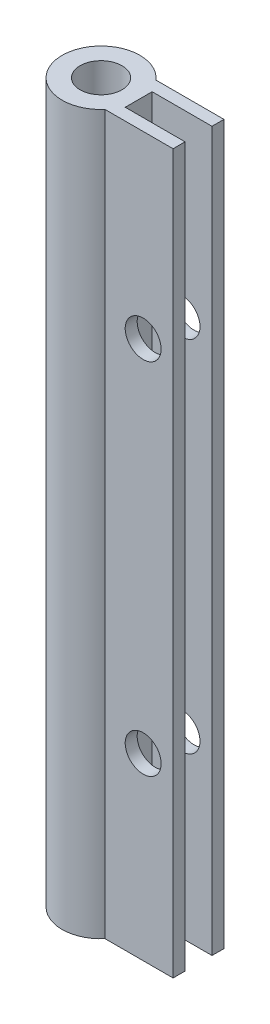
ISO-10303-21;
HEADER;
FILE_DESCRIPTION(('STEP AP214'),'2;1');
FILE_NAME('part.step','',(''),(''),'','','');
FILE_SCHEMA(('AUTOMOTIVE_DESIGN { 1 0 10303 214 1 1 1 1 }'));
ENDSEC;
DATA;
#1=APPLICATION_CONTEXT('core data for automotive mechanical design processes');
#2=APPLICATION_PROTOCOL_DEFINITION('international standard','automotive_design',2000,#1);
#3=PRODUCT_CONTEXT('',#1,'mechanical');
#4=PRODUCT('Part','Part','',(#3));
#5=PRODUCT_RELATED_PRODUCT_CATEGORY('part','',(#4));
#6=PRODUCT_DEFINITION_FORMATION('','',#4);
#7=PRODUCT_DEFINITION_CONTEXT('part definition',#1,'design');
#8=PRODUCT_DEFINITION('design','',#6,#7);
#9=PRODUCT_DEFINITION_SHAPE('','',#8);
#10=(LENGTH_UNIT() NAMED_UNIT(*) SI_UNIT(.MILLI.,.METRE.));
#11=(NAMED_UNIT(*) PLANE_ANGLE_UNIT() SI_UNIT($,.RADIAN.));
#12=(NAMED_UNIT(*) SI_UNIT($,.STERADIAN.) SOLID_ANGLE_UNIT());
#13=UNCERTAINTY_MEASURE_WITH_UNIT(LENGTH_MEASURE(1.E-05),#10,'distance_accuracy_value','');
#14=(GEOMETRIC_REPRESENTATION_CONTEXT(3) GLOBAL_UNCERTAINTY_ASSIGNED_CONTEXT((#13)) GLOBAL_UNIT_ASSIGNED_CONTEXT((#10,
#11,#12)) REPRESENTATION_CONTEXT('',''));
#15=CARTESIAN_POINT('',(0.,0.,0.));
#16=DIRECTION('',(0.,0.,1.));
#17=DIRECTION('',(1.,0.,0.));
#18=AXIS2_PLACEMENT_3D('',#15,#16,#17);
#19=CARTESIAN_POINT('',(0.,60.,0.));
#20=DIRECTION('',(0.,1.,0.));
#21=DIRECTION('',(0.,0.,1.));
#22=AXIS2_PLACEMENT_3D('',#19,#20,#21);
#23=PLANE('',#22);
#24=DIRECTION('',(1.,0.,0.));
#25=VECTOR('',#24,1.);
#26=CARTESIAN_POINT('',(2.45903944661325,60.,2.125));
#27=LINE('',#26,#25);
#28=CARTESIAN_POINT('',(2.45903944661325,60.,2.125));
#29=VERTEX_POINT('',#28);
#30=CARTESIAN_POINT('',(8.14420001013971,60.,2.125));
#31=VERTEX_POINT('',#30);
#32=EDGE_CURVE('E147',#29,#31,#27,.T.);
#33=ORIENTED_EDGE('',*,*,#32,.T.);
#34=DIRECTION('',(0.,0.,-1.));
#35=VECTOR('',#34,1.);
#36=CARTESIAN_POINT('',(8.14420001013971,60.,1.125));
#37=LINE('',#36,#35);
#38=CARTESIAN_POINT('',(8.14420001013971,60.,1.125));
#39=VERTEX_POINT('',#38);
#40=EDGE_CURVE('E95',#31,#39,#37,.T.);
#41=ORIENTED_EDGE('',*,*,#40,.T.);
#42=DIRECTION('',(-1.,0.,0.));
#43=VECTOR('',#42,1.);
#44=CARTESIAN_POINT('',(3.14420001013971,60.,1.125));
#45=LINE('',#44,#43);
#46=CARTESIAN_POINT('',(3.14420001013971,60.,1.125));
#47=VERTEX_POINT('',#46);
#48=EDGE_CURVE('E190',#39,#47,#45,.T.);
#49=ORIENTED_EDGE('',*,*,#48,.T.);
#50=DIRECTION('',(0.,0.,-1.));
#51=VECTOR('',#50,1.);
#52=CARTESIAN_POINT('',(3.14420001013971,60.,-1.125));
#53=LINE('',#52,#51);
#54=CARTESIAN_POINT('',(3.14420001013971,60.,-1.125));
#55=VERTEX_POINT('',#54);
#56=EDGE_CURVE('E192',#47,#55,#53,.T.);
#57=ORIENTED_EDGE('',*,*,#56,.T.);
#58=DIRECTION('',(1.,0.,0.));
#59=VECTOR('',#58,1.);
#60=CARTESIAN_POINT('',(3.14420001013971,60.,-1.125));
#61=LINE('',#60,#59);
#62=CARTESIAN_POINT('',(8.14420001013971,60.,-1.125));
#63=VERTEX_POINT('',#62);
#64=EDGE_CURVE('E114',#55,#63,#61,.T.);
#65=ORIENTED_EDGE('',*,*,#64,.T.);
#66=DIRECTION('',(0.,0.,-1.));
#67=VECTOR('',#66,1.);
#68=CARTESIAN_POINT('',(8.14420001013971,60.,-2.125));
#69=LINE('',#68,#67);
#70=CARTESIAN_POINT('',(8.14420001013971,60.,-2.125));
#71=VERTEX_POINT('',#70);
#72=EDGE_CURVE('E108',#63,#71,#69,.T.);
#73=ORIENTED_EDGE('',*,*,#72,.T.);
#74=DIRECTION('',(-1.,0.,0.));
#75=VECTOR('',#74,1.);
#76=CARTESIAN_POINT('',(2.45903944661325,60.,-2.125));
#77=LINE('',#76,#75);
#78=CARTESIAN_POINT('',(2.45903944661325,60.,-2.125));
#79=VERTEX_POINT('',#78);
#80=EDGE_CURVE('E112',#71,#79,#77,.T.);
#81=ORIENTED_EDGE('',*,*,#80,.T.);
#82=CARTESIAN_POINT('',(0.,60.,0.));
#83=DIRECTION('',(0.,1.,0.));
#84=DIRECTION('',(0.,0.,1.));
#85=AXIS2_PLACEMENT_3D('',#82,#83,#84);
#86=CIRCLE('',#85,3.25);
#87=EDGE_CURVE('E52',#79,#29,#86,.T.);
#88=ORIENTED_EDGE('',*,*,#87,.T.);
#89=EDGE_LOOP('',(#33,#41,#49,#57,#65,#73,#81,#88));
#90=FACE_BOUND('',#89,.T.);
#91=CARTESIAN_POINT('',(0.,60.,0.));
#92=DIRECTION('',(0.,1.,0.));
#93=DIRECTION('',(0.,0.,1.));
#94=AXIS2_PLACEMENT_3D('',#91,#92,#93);
#95=CIRCLE('',#94,1.75);
#96=CARTESIAN_POINT('',(0.,60.,1.75));
#97=VERTEX_POINT('',#96);
#98=EDGE_CURVE('E136',#97,#97,#95,.T.);
#99=ORIENTED_EDGE('',*,*,#98,.F.);
#100=EDGE_LOOP('',(#99));
#101=FACE_BOUND('',#100,.T.);
#102=ADVANCED_FACE('F33',(#90,#101),#23,.T.);
#103=CARTESIAN_POINT('',(0.,0.,0.));
#104=DIRECTION('',(0.,1.,0.));
#105=DIRECTION('',(0.,0.,1.));
#106=AXIS2_PLACEMENT_3D('',#103,#104,#105);
#107=PLANE('',#106);
#108=DIRECTION('',(1.,0.,0.));
#109=VECTOR('',#108,1.);
#110=CARTESIAN_POINT('',(2.45903944661325,0.,2.125));
#111=LINE('',#110,#109);
#112=CARTESIAN_POINT('',(2.45903944661325,0.,2.125));
#113=VERTEX_POINT('',#112);
#114=CARTESIAN_POINT('',(8.14420001013971,0.,2.125));
#115=VERTEX_POINT('',#114);
#116=EDGE_CURVE('E132',#113,#115,#111,.T.);
#117=ORIENTED_EDGE('',*,*,#116,.F.);
#118=CARTESIAN_POINT('',(0.,0.,0.));
#119=DIRECTION('',(0.,1.,0.));
#120=DIRECTION('',(0.,0.,1.));
#121=AXIS2_PLACEMENT_3D('',#118,#119,#120);
#122=CIRCLE('',#121,3.25);
#123=CARTESIAN_POINT('',(2.45903944661325,0.,-2.125));
#124=VERTEX_POINT('',#123);
#125=EDGE_CURVE('E87',#124,#113,#122,.T.);
#126=ORIENTED_EDGE('',*,*,#125,.F.);
#127=DIRECTION('',(-1.,0.,0.));
#128=VECTOR('',#127,1.);
#129=CARTESIAN_POINT('',(2.45903944661325,0.,-2.125));
#130=LINE('',#129,#128);
#131=CARTESIAN_POINT('',(8.14420001013971,0.,-2.125));
#132=VERTEX_POINT('',#131);
#133=EDGE_CURVE('E81',#132,#124,#130,.T.);
#134=ORIENTED_EDGE('',*,*,#133,.F.);
#135=DIRECTION('',(0.,0.,-1.));
#136=VECTOR('',#135,1.);
#137=CARTESIAN_POINT('',(8.14420001013971,0.,-2.125));
#138=LINE('',#137,#136);
#139=CARTESIAN_POINT('',(8.14420001013971,0.,-1.125));
#140=VERTEX_POINT('',#139);
#141=EDGE_CURVE('E122',#140,#132,#138,.T.);
#142=ORIENTED_EDGE('',*,*,#141,.F.);
#143=DIRECTION('',(1.,0.,0.));
#144=VECTOR('',#143,1.);
#145=CARTESIAN_POINT('',(3.14420001013971,0.,-1.125));
#146=LINE('',#145,#144);
#147=CARTESIAN_POINT('',(3.14420001013971,0.,-1.125));
#148=VERTEX_POINT('',#147);
#149=EDGE_CURVE('E142',#148,#140,#146,.T.);
#150=ORIENTED_EDGE('',*,*,#149,.F.);
#151=DIRECTION('',(0.,0.,-1.));
#152=VECTOR('',#151,1.);
#153=CARTESIAN_POINT('',(3.14420001013971,0.,-1.125));
#154=LINE('',#153,#152);
#155=CARTESIAN_POINT('',(3.14420001013971,0.,1.125));
#156=VERTEX_POINT('',#155);
#157=EDGE_CURVE('E140',#156,#148,#154,.T.);
#158=ORIENTED_EDGE('',*,*,#157,.F.);
#159=DIRECTION('',(-1.,0.,0.));
#160=VECTOR('',#159,1.);
#161=CARTESIAN_POINT('',(3.14420001013971,0.,1.125));
#162=LINE('',#161,#160);
#163=CARTESIAN_POINT('',(8.14420001013971,0.,1.125));
#164=VERTEX_POINT('',#163);
#165=EDGE_CURVE('E138',#164,#156,#162,.T.);
#166=ORIENTED_EDGE('',*,*,#165,.F.);
#167=DIRECTION('',(0.,0.,-1.));
#168=VECTOR('',#167,1.);
#169=CARTESIAN_POINT('',(8.14420001013971,0.,1.125));
#170=LINE('',#169,#168);
#171=EDGE_CURVE('E135',#115,#164,#170,.T.);
#172=ORIENTED_EDGE('',*,*,#171,.F.);
#173=EDGE_LOOP('',(#117,#126,#134,#142,#150,#158,#166,#172));
#174=FACE_BOUND('',#173,.T.);
#175=CARTESIAN_POINT('',(0.,0.,0.));
#176=DIRECTION('',(0.,1.,0.));
#177=DIRECTION('',(0.,0.,1.));
#178=AXIS2_PLACEMENT_3D('',#175,#176,#177);
#179=CIRCLE('',#178,1.75);
#180=CARTESIAN_POINT('',(0.,0.,1.75));
#181=VERTEX_POINT('',#180);
#182=EDGE_CURVE('E183',#181,#181,#179,.T.);
#183=ORIENTED_EDGE('',*,*,#182,.T.);
#184=EDGE_LOOP('',(#183));
#185=FACE_BOUND('',#184,.T.);
#186=ADVANCED_FACE('F205',(#174,#185),#107,.F.);
#187=CARTESIAN_POINT('',(2.45903944661325,60.,2.125));
#188=DIRECTION('',(0.,0.,-1.));
#189=DIRECTION('',(-1.,0.,0.));
#190=AXIS2_PLACEMENT_3D('',#187,#188,#189);
#191=PLANE('',#190);
#192=CARTESIAN_POINT('',(5.64420001013971,45.,2.125));
#193=DIRECTION('',(0.,0.,1.));
#194=DIRECTION('',(1.,0.,0.));
#195=AXIS2_PLACEMENT_3D('',#192,#193,#194);
#196=CIRCLE('',#195,1.5);
#197=CARTESIAN_POINT('',(7.14420001013971,45.,2.125));
#198=VERTEX_POINT('',#197);
#199=EDGE_CURVE('E161',#198,#198,#196,.T.);
#200=ORIENTED_EDGE('',*,*,#199,.F.);
#201=EDGE_LOOP('',(#200));
#202=FACE_BOUND('',#201,.T.);
#203=CARTESIAN_POINT('',(5.64420001013972,15.,2.125));
#204=DIRECTION('',(0.,0.,1.));
#205=DIRECTION('',(1.,0.,0.));
#206=AXIS2_PLACEMENT_3D('',#203,#204,#205);
#207=CIRCLE('',#206,1.5);
#208=CARTESIAN_POINT('',(7.14420001013972,15.,2.125));
#209=VERTEX_POINT('',#208);
#210=EDGE_CURVE('E168',#209,#209,#207,.T.);
#211=ORIENTED_EDGE('',*,*,#210,.F.);
#212=EDGE_LOOP('',(#211));
#213=FACE_BOUND('',#212,.T.);
#214=ORIENTED_EDGE('',*,*,#116,.T.);
#215=DIRECTION('',(0.,-1.,0.));
#216=VECTOR('',#215,1.);
#217=CARTESIAN_POINT('',(8.14420001013971,60.,2.125));
#218=LINE('',#217,#216);
#219=EDGE_CURVE('E11',#31,#115,#218,.T.);
#220=ORIENTED_EDGE('',*,*,#219,.F.);
#221=ORIENTED_EDGE('',*,*,#32,.F.);
#222=DIRECTION('',(0.,-1.,0.));
#223=VECTOR('',#222,1.);
#224=CARTESIAN_POINT('',(2.45903944661325,60.,2.125));
#225=LINE('',#224,#223);
#226=EDGE_CURVE('E128',#29,#113,#225,.T.);
#227=ORIENTED_EDGE('',*,*,#226,.T.);
#228=EDGE_LOOP('',(#214,#220,#221,#227));
#229=FACE_BOUND('',#228,.T.);
#230=ADVANCED_FACE('F35',(#202,#213,#229),#191,.F.);
#231=CARTESIAN_POINT('',(8.14420001013971,60.,1.125));
#232=DIRECTION('',(-1.,0.,0.));
#233=DIRECTION('',(0.,0.,1.));
#234=AXIS2_PLACEMENT_3D('',#231,#232,#233);
#235=PLANE('',#234);
#236=ORIENTED_EDGE('',*,*,#171,.T.);
#237=DIRECTION('',(0.,-1.,0.));
#238=VECTOR('',#237,1.);
#239=CARTESIAN_POINT('',(8.14420001013971,60.,1.125));
#240=LINE('',#239,#238);
#241=EDGE_CURVE('E43',#39,#164,#240,.T.);
#242=ORIENTED_EDGE('',*,*,#241,.F.);
#243=ORIENTED_EDGE('',*,*,#40,.F.);
#244=ORIENTED_EDGE('',*,*,#219,.T.);
#245=EDGE_LOOP('',(#236,#242,#243,#244));
#246=FACE_BOUND('',#245,.T.);
#247=ADVANCED_FACE('F266',(#246),#235,.F.);
#248=CARTESIAN_POINT('',(3.14420001013971,60.,1.125));
#249=DIRECTION('',(0.,0.,1.));
#250=DIRECTION('',(1.,0.,0.));
#251=AXIS2_PLACEMENT_3D('',#248,#249,#250);
#252=PLANE('',#251);
#253=CARTESIAN_POINT('',(5.64420001013971,45.,1.125));
#254=DIRECTION('',(0.,0.,1.));
#255=DIRECTION('',(1.,0.,0.));
#256=AXIS2_PLACEMENT_3D('',#253,#254,#255);
#257=CIRCLE('',#256,1.5);
#258=CARTESIAN_POINT('',(7.14420001013971,45.,1.125));
#259=VERTEX_POINT('',#258);
#260=EDGE_CURVE('E180',#259,#259,#257,.T.);
#261=ORIENTED_EDGE('',*,*,#260,.T.);
#262=EDGE_LOOP('',(#261));
#263=FACE_BOUND('',#262,.T.);
#264=CARTESIAN_POINT('',(5.64420001013972,15.,1.125));
#265=DIRECTION('',(0.,0.,1.));
#266=DIRECTION('',(1.,0.,0.));
#267=AXIS2_PLACEMENT_3D('',#264,#265,#266);
#268=CIRCLE('',#267,1.5);
#269=CARTESIAN_POINT('',(7.14420001013972,15.,1.125));
#270=VERTEX_POINT('',#269);
#271=EDGE_CURVE('E165',#270,#270,#268,.T.);
#272=ORIENTED_EDGE('',*,*,#271,.T.);
#273=EDGE_LOOP('',(#272));
#274=FACE_BOUND('',#273,.T.);
#275=ORIENTED_EDGE('',*,*,#165,.T.);
#276=DIRECTION('',(0.,-1.,0.));
#277=VECTOR('',#276,1.);
#278=CARTESIAN_POINT('',(3.14420001013971,60.,1.125));
#279=LINE('',#278,#277);
#280=EDGE_CURVE('E154',#47,#156,#279,.T.);
#281=ORIENTED_EDGE('',*,*,#280,.F.);
#282=ORIENTED_EDGE('',*,*,#48,.F.);
#283=ORIENTED_EDGE('',*,*,#241,.T.);
#284=EDGE_LOOP('',(#275,#281,#282,#283));
#285=FACE_BOUND('',#284,.T.);
#286=ADVANCED_FACE('F262',(#263,#274,#285),#252,.F.);
#287=CARTESIAN_POINT('',(3.14420001013971,60.,-1.125));
#288=DIRECTION('',(-1.,0.,0.));
#289=DIRECTION('',(0.,0.,1.));
#290=AXIS2_PLACEMENT_3D('',#287,#288,#289);
#291=PLANE('',#290);
#292=ORIENTED_EDGE('',*,*,#157,.T.);
#293=DIRECTION('',(0.,-1.,0.));
#294=VECTOR('',#293,1.);
#295=CARTESIAN_POINT('',(3.14420001013971,60.,-1.125));
#296=LINE('',#295,#294);
#297=EDGE_CURVE('E151',#55,#148,#296,.T.);
#298=ORIENTED_EDGE('',*,*,#297,.F.);
#299=ORIENTED_EDGE('',*,*,#56,.F.);
#300=ORIENTED_EDGE('',*,*,#280,.T.);
#301=EDGE_LOOP('',(#292,#298,#299,#300));
#302=FACE_BOUND('',#301,.T.);
#303=ADVANCED_FACE('F198',(#302),#291,.F.);
#304=CARTESIAN_POINT('',(3.14420001013971,60.,-1.125));
#305=DIRECTION('',(0.,0.,-1.));
#306=DIRECTION('',(-1.,0.,0.));
#307=AXIS2_PLACEMENT_3D('',#304,#305,#306);
#308=PLANE('',#307);
#309=CARTESIAN_POINT('',(5.64420001013971,45.,-1.125));
#310=DIRECTION('',(0.,0.,-1.));
#311=DIRECTION('',(-1.,0.,0.));
#312=AXIS2_PLACEMENT_3D('',#309,#310,#311);
#313=CIRCLE('',#312,1.5);
#314=CARTESIAN_POINT('',(4.14420001013971,45.,-1.125));
#315=VERTEX_POINT('',#314);
#316=EDGE_CURVE('E177',#315,#315,#313,.T.);
#317=ORIENTED_EDGE('',*,*,#316,.T.);
#318=EDGE_LOOP('',(#317));
#319=FACE_BOUND('',#318,.T.);
#320=CARTESIAN_POINT('',(5.64420001013972,15.,-1.125));
#321=DIRECTION('',(0.,0.,-1.));
#322=DIRECTION('',(-1.,0.,0.));
#323=AXIS2_PLACEMENT_3D('',#320,#321,#322);
#324=CIRCLE('',#323,1.5);
#325=CARTESIAN_POINT('',(4.14420001013972,15.,-1.125));
#326=VERTEX_POINT('',#325);
#327=EDGE_CURVE('E160',#326,#326,#324,.T.);
#328=ORIENTED_EDGE('',*,*,#327,.T.);
#329=EDGE_LOOP('',(#328));
#330=FACE_BOUND('',#329,.T.);
#331=ORIENTED_EDGE('',*,*,#149,.T.);
#332=DIRECTION('',(0.,-1.,0.));
#333=VECTOR('',#332,1.);
#334=CARTESIAN_POINT('',(8.14420001013971,60.,-1.125));
#335=LINE('',#334,#333);
#336=EDGE_CURVE('E123',#63,#140,#335,.T.);
#337=ORIENTED_EDGE('',*,*,#336,.F.);
#338=ORIENTED_EDGE('',*,*,#64,.F.);
#339=ORIENTED_EDGE('',*,*,#297,.T.);
#340=EDGE_LOOP('',(#331,#337,#338,#339));
#341=FACE_BOUND('',#340,.T.);
#342=ADVANCED_FACE('F202',(#319,#330,#341),#308,.F.);
#343=CARTESIAN_POINT('',(8.14420001013971,60.,-2.125));
#344=DIRECTION('',(-1.,0.,0.));
#345=DIRECTION('',(0.,0.,1.));
#346=AXIS2_PLACEMENT_3D('',#343,#344,#345);
#347=PLANE('',#346);
#348=ORIENTED_EDGE('',*,*,#141,.T.);
#349=DIRECTION('',(0.,-1.,0.));
#350=VECTOR('',#349,1.);
#351=CARTESIAN_POINT('',(8.14420001013971,60.,-2.125));
#352=LINE('',#351,#350);
#353=EDGE_CURVE('E119',#71,#132,#352,.T.);
#354=ORIENTED_EDGE('',*,*,#353,.F.);
#355=ORIENTED_EDGE('',*,*,#72,.F.);
#356=ORIENTED_EDGE('',*,*,#336,.T.);
#357=EDGE_LOOP('',(#348,#354,#355,#356));
#358=FACE_BOUND('',#357,.T.);
#359=ADVANCED_FACE('F120',(#358),#347,.F.);
#360=CARTESIAN_POINT('',(2.45903944661325,60.,-2.125));
#361=DIRECTION('',(0.,0.,1.));
#362=DIRECTION('',(1.,0.,0.));
#363=AXIS2_PLACEMENT_3D('',#360,#361,#362);
#364=PLANE('',#363);
#365=CARTESIAN_POINT('',(5.64420001013971,45.,-2.125));
#366=DIRECTION('',(0.,0.,1.));
#367=DIRECTION('',(1.,0.,0.));
#368=AXIS2_PLACEMENT_3D('',#365,#366,#367);
#369=CIRCLE('',#368,1.5);
#370=CARTESIAN_POINT('',(7.14420001013971,45.,-2.125));
#371=VERTEX_POINT('',#370);
#372=EDGE_CURVE('E37',#371,#371,#369,.T.);
#373=ORIENTED_EDGE('',*,*,#372,.T.);
#374=EDGE_LOOP('',(#373));
#375=FACE_BOUND('',#374,.T.);
#376=CARTESIAN_POINT('',(5.64420001013972,15.,-2.125));
#377=DIRECTION('',(0.,0.,1.));
#378=DIRECTION('',(1.,0.,0.));
#379=AXIS2_PLACEMENT_3D('',#376,#377,#378);
#380=CIRCLE('',#379,1.5);
#381=CARTESIAN_POINT('',(7.14420001013972,15.,-2.125));
#382=VERTEX_POINT('',#381);
#383=EDGE_CURVE('E158',#382,#382,#380,.T.);
#384=ORIENTED_EDGE('',*,*,#383,.T.);
#385=EDGE_LOOP('',(#384));
#386=FACE_BOUND('',#385,.T.);
#387=ORIENTED_EDGE('',*,*,#133,.T.);
#388=DIRECTION('',(0.,-1.,0.));
#389=VECTOR('',#388,1.);
#390=CARTESIAN_POINT('',(2.45903944661325,60.,-2.125));
#391=LINE('',#390,#389);
#392=EDGE_CURVE('E124',#79,#124,#391,.T.);
#393=ORIENTED_EDGE('',*,*,#392,.F.);
#394=ORIENTED_EDGE('',*,*,#80,.F.);
#395=ORIENTED_EDGE('',*,*,#353,.T.);
#396=EDGE_LOOP('',(#387,#393,#394,#395));
#397=FACE_BOUND('',#396,.T.);
#398=ADVANCED_FACE('F126',(#375,#386,#397),#364,.F.);
#399=CARTESIAN_POINT('',(0.,60.,0.));
#400=DIRECTION('',(0.,-1.,0.));
#401=DIRECTION('',(0.,0.,-1.));
#402=AXIS2_PLACEMENT_3D('',#399,#400,#401);
#403=CYLINDRICAL_SURFACE('',#402,3.25);
#404=ORIENTED_EDGE('',*,*,#125,.T.);
#405=ORIENTED_EDGE('',*,*,#226,.F.);
#406=ORIENTED_EDGE('',*,*,#87,.F.);
#407=ORIENTED_EDGE('',*,*,#392,.T.);
#408=EDGE_LOOP('',(#404,#405,#406,#407));
#409=FACE_BOUND('',#408,.T.);
#410=ADVANCED_FACE('F211',(#409),#403,.T.);
#411=CARTESIAN_POINT('',(0.,60.,0.));
#412=DIRECTION('',(0.,-1.,0.));
#413=DIRECTION('',(0.,0.,-1.));
#414=AXIS2_PLACEMENT_3D('',#411,#412,#413);
#415=CYLINDRICAL_SURFACE('',#414,1.75);
#416=ORIENTED_EDGE('',*,*,#98,.T.);
#417=EDGE_LOOP('',(#416));
#418=FACE_BOUND('',#417,.T.);
#419=ORIENTED_EDGE('',*,*,#182,.F.);
#420=EDGE_LOOP('',(#419));
#421=FACE_BOUND('',#420,.T.);
#422=ADVANCED_FACE('F213',(#418,#421),#415,.F.);
#423=CARTESIAN_POINT('',(5.64420001013972,15.,-57.875));
#424=DIRECTION('',(0.,0.,1.));
#425=DIRECTION('',(1.,0.,0.));
#426=AXIS2_PLACEMENT_3D('',#423,#424,#425);
#427=CYLINDRICAL_SURFACE('',#426,1.5);
#428=ORIENTED_EDGE('',*,*,#383,.F.);
#429=EDGE_LOOP('',(#428));
#430=FACE_BOUND('',#429,.T.);
#431=ORIENTED_EDGE('',*,*,#327,.F.);
#432=EDGE_LOOP('',(#431));
#433=FACE_BOUND('',#432,.T.);
#434=ADVANCED_FACE('F219',(#430,#433),#427,.F.);
#435=CARTESIAN_POINT('',(5.64420001013971,45.,-57.875));
#436=DIRECTION('',(0.,0.,1.));
#437=DIRECTION('',(1.,0.,0.));
#438=AXIS2_PLACEMENT_3D('',#435,#436,#437);
#439=CYLINDRICAL_SURFACE('',#438,1.5);
#440=ORIENTED_EDGE('',*,*,#372,.F.);
#441=EDGE_LOOP('',(#440));
#442=FACE_BOUND('',#441,.T.);
#443=ORIENTED_EDGE('',*,*,#316,.F.);
#444=EDGE_LOOP('',(#443));
#445=FACE_BOUND('',#444,.T.);
#446=ADVANCED_FACE('F235',(#442,#445),#439,.F.);
#447=ORIENTED_EDGE('',*,*,#210,.T.);
#448=EDGE_LOOP('',(#447));
#449=FACE_BOUND('',#448,.T.);
#450=ORIENTED_EDGE('',*,*,#271,.F.);
#451=EDGE_LOOP('',(#450));
#452=FACE_BOUND('',#451,.T.);
#453=ADVANCED_FACE('F231',(#449,#452),#427,.F.);
#454=ORIENTED_EDGE('',*,*,#199,.T.);
#455=EDGE_LOOP('',(#454));
#456=FACE_BOUND('',#455,.T.);
#457=ORIENTED_EDGE('',*,*,#260,.F.);
#458=EDGE_LOOP('',(#457));
#459=FACE_BOUND('',#458,.T.);
#460=ADVANCED_FACE('F234',(#456,#459),#439,.F.);
#461=CLOSED_SHELL('',(#102,#186,#230,#247,#286,#303,#342,#359,#398,#410,#422,#434,#446,#453,#460));
#462=MANIFOLD_SOLID_BREP('B2',#461);
#463=ADVANCED_BREP_SHAPE_REPRESENTATION('',(#18,#462),#14);
#464=SHAPE_DEFINITION_REPRESENTATION(#9,#463);
ENDSEC;
END-ISO-10303-21;
